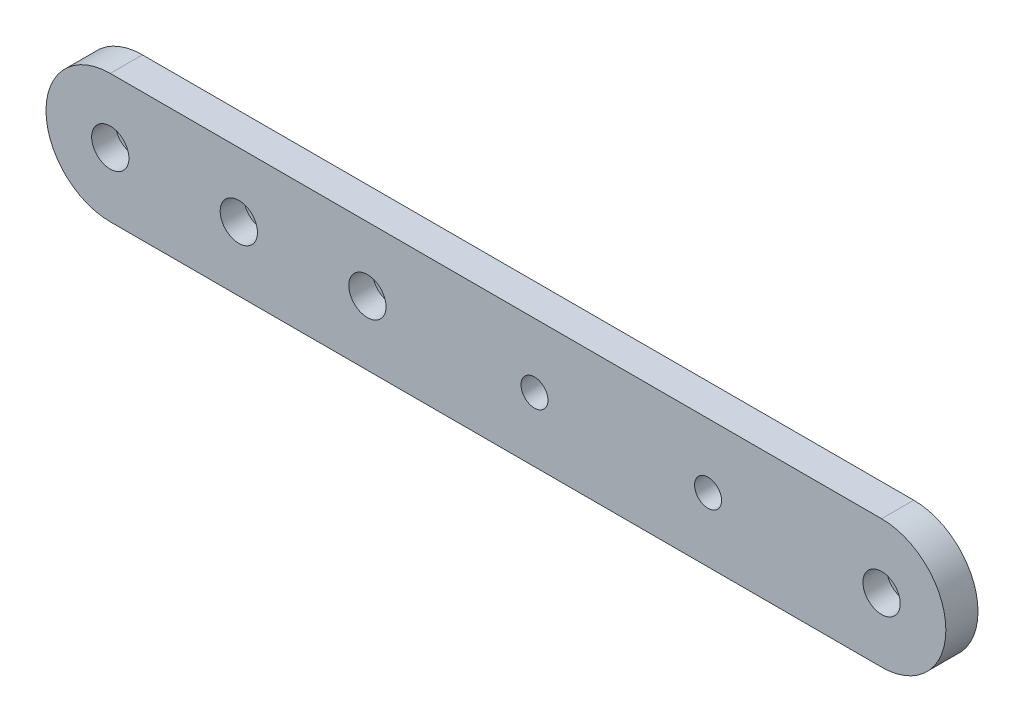
ISO-10303-21;
HEADER;
FILE_DESCRIPTION(('STEP AP214'),'2;1');
FILE_NAME('part.step','',(''),(''),'','','');
FILE_SCHEMA(('AUTOMOTIVE_DESIGN { 1 0 10303 214 1 1 1 1 }'));
ENDSEC;
DATA;
#1=APPLICATION_CONTEXT('core data for automotive mechanical design processes');
#2=APPLICATION_PROTOCOL_DEFINITION('international standard','automotive_design',2000,#1);
#3=PRODUCT_CONTEXT('',#1,'mechanical');
#4=PRODUCT('Part','Part','',(#3));
#5=PRODUCT_RELATED_PRODUCT_CATEGORY('part','',(#4));
#6=PRODUCT_DEFINITION_FORMATION('','',#4);
#7=PRODUCT_DEFINITION_CONTEXT('part definition',#1,'design');
#8=PRODUCT_DEFINITION('design','',#6,#7);
#9=PRODUCT_DEFINITION_SHAPE('','',#8);
#10=(LENGTH_UNIT() NAMED_UNIT(*) SI_UNIT(.MILLI.,.METRE.));
#11=(NAMED_UNIT(*) PLANE_ANGLE_UNIT() SI_UNIT($,.RADIAN.));
#12=(NAMED_UNIT(*) SI_UNIT($,.STERADIAN.) SOLID_ANGLE_UNIT());
#13=UNCERTAINTY_MEASURE_WITH_UNIT(LENGTH_MEASURE(1.E-05),#10,'distance_accuracy_value','');
#14=(GEOMETRIC_REPRESENTATION_CONTEXT(3) GLOBAL_UNCERTAINTY_ASSIGNED_CONTEXT((#13)) GLOBAL_UNIT_ASSIGNED_CONTEXT((#10,
#11,#12)) REPRESENTATION_CONTEXT('',''));
#15=CARTESIAN_POINT('',(0.,0.,0.));
#16=DIRECTION('',(0.,0.,1.));
#17=DIRECTION('',(1.,0.,0.));
#18=AXIS2_PLACEMENT_3D('',#15,#16,#17);
#19=CARTESIAN_POINT('',(-60.,0.,5.));
#20=DIRECTION('',(0.,0.,-1.));
#21=DIRECTION('',(-1.,0.,0.));
#22=AXIS2_PLACEMENT_3D('',#19,#20,#21);
#23=PLANE('',#22);
#24=CARTESIAN_POINT('',(33.,0.,5.0000000000001));
#25=DIRECTION('',(0.,0.,-1.));
#26=DIRECTION('',(-1.,0.,0.));
#27=AXIS2_PLACEMENT_3D('',#24,#25,#26);
#28=CIRCLE('',#27,2.1);
#29=CARTESIAN_POINT('',(30.9,0.,5.0000000000001));
#30=VERTEX_POINT('',#29);
#31=EDGE_CURVE('E246',#30,#30,#28,.T.);
#32=ORIENTED_EDGE('',*,*,#31,.T.);
#33=EDGE_LOOP('',(#32));
#34=FACE_BOUND('',#33,.T.);
#35=CARTESIAN_POINT('',(6.00000000000001,0.,5.0000000000001));
#36=DIRECTION('',(0.,0.,-1.));
#37=DIRECTION('',(-1.,0.,0.));
#38=AXIS2_PLACEMENT_3D('',#35,#36,#37);
#39=CIRCLE('',#38,2.1);
#40=CARTESIAN_POINT('',(3.90000000000001,0.,5.0000000000001));
#41=VERTEX_POINT('',#40);
#42=EDGE_CURVE('E254',#41,#41,#39,.T.);
#43=ORIENTED_EDGE('',*,*,#42,.T.);
#44=EDGE_LOOP('',(#43));
#45=FACE_BOUND('',#44,.T.);
#46=CARTESIAN_POINT('',(-40.,0.,5.00000000000008));
#47=DIRECTION('',(0.,0.,-1.));
#48=DIRECTION('',(-1.,0.,0.));
#49=AXIS2_PLACEMENT_3D('',#46,#47,#48);
#50=CIRCLE('',#49,2.9);
#51=CARTESIAN_POINT('',(-42.9,0.,5.00000000000008));
#52=VERTEX_POINT('',#51);
#53=EDGE_CURVE('E258',#52,#52,#50,.T.);
#54=ORIENTED_EDGE('',*,*,#53,.T.);
#55=EDGE_LOOP('',(#54));
#56=FACE_BOUND('',#55,.T.);
#57=CARTESIAN_POINT('',(-20.,0.,5.00000000000007));
#58=DIRECTION('',(0.,0.,-1.));
#59=DIRECTION('',(-1.,0.,0.));
#60=AXIS2_PLACEMENT_3D('',#57,#58,#59);
#61=CIRCLE('',#60,2.9);
#62=CARTESIAN_POINT('',(-22.9,0.,5.00000000000007));
#63=VERTEX_POINT('',#62);
#64=EDGE_CURVE('E117',#63,#63,#61,.T.);
#65=ORIENTED_EDGE('',*,*,#64,.T.);
#66=EDGE_LOOP('',(#65));
#67=FACE_BOUND('',#66,.T.);
#68=CARTESIAN_POINT('',(-60.,0.,5.0000000000001));
#69=DIRECTION('',(0.,0.,-1.));
#70=DIRECTION('',(-1.,0.,0.));
#71=AXIS2_PLACEMENT_3D('',#68,#69,#70);
#72=CIRCLE('',#71,2.89999999999999);
#73=CARTESIAN_POINT('',(-62.9,0.,5.0000000000001));
#74=VERTEX_POINT('',#73);
#75=EDGE_CURVE('E113',#74,#74,#72,.T.);
#76=ORIENTED_EDGE('',*,*,#75,.T.);
#77=EDGE_LOOP('',(#76));
#78=FACE_BOUND('',#77,.T.);
#79=CARTESIAN_POINT('',(60.,0.,5.00000000000001));
#80=DIRECTION('',(0.,0.,-1.));
#81=DIRECTION('',(-1.,0.,0.));
#82=AXIS2_PLACEMENT_3D('',#79,#80,#81);
#83=CIRCLE('',#82,2.89999999999989);
#84=CARTESIAN_POINT('',(57.1000000000001,0.,5.00000000000001));
#85=VERTEX_POINT('',#84);
#86=EDGE_CURVE('E109',#85,#85,#83,.T.);
#87=ORIENTED_EDGE('',*,*,#86,.T.);
#88=EDGE_LOOP('',(#87));
#89=FACE_BOUND('',#88,.T.);
#90=CARTESIAN_POINT('',(-60.,0.,5.));
#91=DIRECTION('',(0.,0.,1.));
#92=DIRECTION('',(-1.,0.,0.));
#93=AXIS2_PLACEMENT_3D('',#90,#91,#92);
#94=CIRCLE('',#93,10.);
#95=CARTESIAN_POINT('',(-60.,9.99999999999995,5.));
#96=VERTEX_POINT('',#95);
#97=CARTESIAN_POINT('',(-60.,-10.0000000000001,5.));
#98=VERTEX_POINT('',#97);
#99=EDGE_CURVE('E83',#96,#98,#94,.T.);
#100=ORIENTED_EDGE('',*,*,#99,.T.);
#101=DIRECTION('',(1.,0.,0.));
#102=VECTOR('',#101,1.);
#103=CARTESIAN_POINT('',(60.,-10.,5.));
#104=LINE('',#103,#102);
#105=CARTESIAN_POINT('',(60.,-10.,5.));
#106=VERTEX_POINT('',#105);
#107=EDGE_CURVE('E79',#98,#106,#104,.T.);
#108=ORIENTED_EDGE('',*,*,#107,.T.);
#109=CARTESIAN_POINT('',(60.,0.,5.));
#110=DIRECTION('',(0.,0.,1.));
#111=DIRECTION('',(1.,0.,0.));
#112=AXIS2_PLACEMENT_3D('',#109,#110,#111);
#113=CIRCLE('',#112,10.);
#114=CARTESIAN_POINT('',(60.,10.,5.));
#115=VERTEX_POINT('',#114);
#116=EDGE_CURVE('E81',#106,#115,#113,.T.);
#117=ORIENTED_EDGE('',*,*,#116,.T.);
#118=DIRECTION('',(-1.,0.,0.));
#119=VECTOR('',#118,1.);
#120=CARTESIAN_POINT('',(-60.,9.99999999999995,5.));
#121=LINE('',#120,#119);
#122=EDGE_CURVE('E49',#115,#96,#121,.T.);
#123=ORIENTED_EDGE('',*,*,#122,.T.);
#124=EDGE_LOOP('',(#100,#108,#117,#123));
#125=FACE_BOUND('',#124,.T.);
#126=ADVANCED_FACE('F30',(#34,#45,#56,#67,#78,#89,#125),#23,.F.);
#127=CARTESIAN_POINT('',(-60.,0.,0.));
#128=DIRECTION('',(0.,0.,-1.));
#129=DIRECTION('',(-1.,0.,0.));
#130=AXIS2_PLACEMENT_3D('',#127,#128,#129);
#131=PLANE('',#130);
#132=CARTESIAN_POINT('',(33.,0.,0.));
#133=DIRECTION('',(0.,0.,-1.));
#134=DIRECTION('',(-1.,0.,0.));
#135=AXIS2_PLACEMENT_3D('',#132,#133,#134);
#136=CIRCLE('',#135,2.1);
#137=CARTESIAN_POINT('',(30.9,0.,0.));
#138=VERTEX_POINT('',#137);
#139=EDGE_CURVE('E249',#138,#138,#136,.T.);
#140=ORIENTED_EDGE('',*,*,#139,.F.);
#141=EDGE_LOOP('',(#140));
#142=FACE_BOUND('',#141,.T.);
#143=CARTESIAN_POINT('',(6.00000000000001,0.,0.));
#144=DIRECTION('',(0.,0.,-1.));
#145=DIRECTION('',(-1.,0.,0.));
#146=AXIS2_PLACEMENT_3D('',#143,#144,#145);
#147=CIRCLE('',#146,2.1);
#148=CARTESIAN_POINT('',(3.90000000000001,0.,0.));
#149=VERTEX_POINT('',#148);
#150=EDGE_CURVE('E251',#149,#149,#147,.T.);
#151=ORIENTED_EDGE('',*,*,#150,.F.);
#152=EDGE_LOOP('',(#151));
#153=FACE_BOUND('',#152,.T.);
#154=CARTESIAN_POINT('',(60.,0.,0.));
#155=DIRECTION('',(0.,0.,1.));
#156=DIRECTION('',(1.,0.,0.));
#157=AXIS2_PLACEMENT_3D('',#154,#155,#156);
#158=CIRCLE('',#157,1.5);
#159=CARTESIAN_POINT('',(61.5,0.,0.));
#160=VERTEX_POINT('',#159);
#161=EDGE_CURVE('E141',#160,#160,#158,.T.);
#162=ORIENTED_EDGE('',*,*,#161,.T.);
#163=EDGE_LOOP('',(#162));
#164=FACE_BOUND('',#163,.T.);
#165=CARTESIAN_POINT('',(-40.,0.,0.));
#166=DIRECTION('',(0.,0.,1.));
#167=DIRECTION('',(1.,0.,0.));
#168=AXIS2_PLACEMENT_3D('',#165,#166,#167);
#169=CIRCLE('',#168,1.5);
#170=CARTESIAN_POINT('',(-38.5,0.,0.));
#171=VERTEX_POINT('',#170);
#172=EDGE_CURVE('E99',#171,#171,#169,.T.);
#173=ORIENTED_EDGE('',*,*,#172,.T.);
#174=EDGE_LOOP('',(#173));
#175=FACE_BOUND('',#174,.T.);
#176=CARTESIAN_POINT('',(-60.,0.,0.));
#177=DIRECTION('',(0.,0.,1.));
#178=DIRECTION('',(-1.,0.,0.));
#179=AXIS2_PLACEMENT_3D('',#176,#177,#178);
#180=CIRCLE('',#179,10.);
#181=CARTESIAN_POINT('',(-60.,9.99999999999995,0.));
#182=VERTEX_POINT('',#181);
#183=CARTESIAN_POINT('',(-60.,-10.0000000000001,0.));
#184=VERTEX_POINT('',#183);
#185=EDGE_CURVE('E96',#182,#184,#180,.T.);
#186=ORIENTED_EDGE('',*,*,#185,.F.);
#187=DIRECTION('',(-1.,0.,0.));
#188=VECTOR('',#187,1.);
#189=CARTESIAN_POINT('',(-60.,9.99999999999995,0.));
#190=LINE('',#189,#188);
#191=CARTESIAN_POINT('',(60.,10.,0.));
#192=VERTEX_POINT('',#191);
#193=EDGE_CURVE('E72',#192,#182,#190,.T.);
#194=ORIENTED_EDGE('',*,*,#193,.F.);
#195=CARTESIAN_POINT('',(60.,0.,0.));
#196=DIRECTION('',(0.,0.,1.));
#197=DIRECTION('',(1.,0.,0.));
#198=AXIS2_PLACEMENT_3D('',#195,#196,#197);
#199=CIRCLE('',#198,10.);
#200=CARTESIAN_POINT('',(60.,-10.,0.));
#201=VERTEX_POINT('',#200);
#202=EDGE_CURVE('E66',#201,#192,#199,.T.);
#203=ORIENTED_EDGE('',*,*,#202,.F.);
#204=DIRECTION('',(1.,0.,0.));
#205=VECTOR('',#204,1.);
#206=CARTESIAN_POINT('',(60.,-10.,0.));
#207=LINE('',#206,#205);
#208=EDGE_CURVE('E87',#184,#201,#207,.T.);
#209=ORIENTED_EDGE('',*,*,#208,.F.);
#210=EDGE_LOOP('',(#186,#194,#203,#209));
#211=FACE_BOUND('',#210,.T.);
#212=CARTESIAN_POINT('',(-20.,0.,0.));
#213=DIRECTION('',(0.,0.,1.));
#214=DIRECTION('',(1.,0.,0.));
#215=AXIS2_PLACEMENT_3D('',#212,#213,#214);
#216=CIRCLE('',#215,1.5);
#217=CARTESIAN_POINT('',(-18.5,0.,0.));
#218=VERTEX_POINT('',#217);
#219=EDGE_CURVE('E144',#218,#218,#216,.T.);
#220=ORIENTED_EDGE('',*,*,#219,.T.);
#221=EDGE_LOOP('',(#220));
#222=FACE_BOUND('',#221,.T.);
#223=CARTESIAN_POINT('',(-60.,0.,0.));
#224=DIRECTION('',(0.,0.,1.));
#225=DIRECTION('',(1.,0.,0.));
#226=AXIS2_PLACEMENT_3D('',#223,#224,#225);
#227=CIRCLE('',#226,1.50000000000002);
#228=CARTESIAN_POINT('',(-58.5,0.,0.));
#229=VERTEX_POINT('',#228);
#230=EDGE_CURVE('E108',#229,#229,#227,.T.);
#231=ORIENTED_EDGE('',*,*,#230,.T.);
#232=EDGE_LOOP('',(#231));
#233=FACE_BOUND('',#232,.T.);
#234=ADVANCED_FACE('F150',(#142,#153,#164,#175,#211,#222,#233),#131,.T.);
#235=CARTESIAN_POINT('',(-60.,0.,5.));
#236=DIRECTION('',(0.,0.,-1.));
#237=DIRECTION('',(-1.,0.,0.));
#238=AXIS2_PLACEMENT_3D('',#235,#236,#237);
#239=CYLINDRICAL_SURFACE('',#238,10.);
#240=ORIENTED_EDGE('',*,*,#185,.T.);
#241=DIRECTION('',(0.,0.,-1.));
#242=VECTOR('',#241,1.);
#243=CARTESIAN_POINT('',(-60.,-10.0000000000001,5.));
#244=LINE('',#243,#242);
#245=EDGE_CURVE('E11',#98,#184,#244,.T.);
#246=ORIENTED_EDGE('',*,*,#245,.F.);
#247=ORIENTED_EDGE('',*,*,#99,.F.);
#248=DIRECTION('',(0.,0.,-1.));
#249=VECTOR('',#248,1.);
#250=CARTESIAN_POINT('',(-60.,9.99999999999995,5.));
#251=LINE('',#250,#249);
#252=EDGE_CURVE('E92',#96,#182,#251,.T.);
#253=ORIENTED_EDGE('',*,*,#252,.T.);
#254=EDGE_LOOP('',(#240,#246,#247,#253));
#255=FACE_BOUND('',#254,.T.);
#256=ADVANCED_FACE('F32',(#255),#239,.T.);
#257=CARTESIAN_POINT('',(60.,-10.,5.));
#258=DIRECTION('',(0.,1.,0.));
#259=DIRECTION('',(-1.,0.,0.));
#260=AXIS2_PLACEMENT_3D('',#257,#258,#259);
#261=PLANE('',#260);
#262=ORIENTED_EDGE('',*,*,#208,.T.);
#263=DIRECTION('',(0.,0.,-1.));
#264=VECTOR('',#263,1.);
#265=CARTESIAN_POINT('',(60.,-10.,5.));
#266=LINE('',#265,#264);
#267=EDGE_CURVE('E40',#106,#201,#266,.T.);
#268=ORIENTED_EDGE('',*,*,#267,.F.);
#269=ORIENTED_EDGE('',*,*,#107,.F.);
#270=ORIENTED_EDGE('',*,*,#245,.T.);
#271=EDGE_LOOP('',(#262,#268,#269,#270));
#272=FACE_BOUND('',#271,.T.);
#273=ADVANCED_FACE('F86',(#272),#261,.F.);
#274=CARTESIAN_POINT('',(60.,0.,5.));
#275=DIRECTION('',(0.,0.,-1.));
#276=DIRECTION('',(-1.,0.,0.));
#277=AXIS2_PLACEMENT_3D('',#274,#275,#276);
#278=CYLINDRICAL_SURFACE('',#277,10.);
#279=ORIENTED_EDGE('',*,*,#202,.T.);
#280=DIRECTION('',(0.,0.,-1.));
#281=VECTOR('',#280,1.);
#282=CARTESIAN_POINT('',(60.,10.,5.));
#283=LINE('',#282,#281);
#284=EDGE_CURVE('E88',#115,#192,#283,.T.);
#285=ORIENTED_EDGE('',*,*,#284,.F.);
#286=ORIENTED_EDGE('',*,*,#116,.F.);
#287=ORIENTED_EDGE('',*,*,#267,.T.);
#288=EDGE_LOOP('',(#279,#285,#286,#287));
#289=FACE_BOUND('',#288,.T.);
#290=ADVANCED_FACE('F90',(#289),#278,.T.);
#291=CARTESIAN_POINT('',(-60.,9.99999999999995,5.));
#292=DIRECTION('',(0.,-1.,0.));
#293=DIRECTION('',(1.,0.,0.));
#294=AXIS2_PLACEMENT_3D('',#291,#292,#293);
#295=PLANE('',#294);
#296=ORIENTED_EDGE('',*,*,#193,.T.);
#297=ORIENTED_EDGE('',*,*,#252,.F.);
#298=ORIENTED_EDGE('',*,*,#122,.F.);
#299=ORIENTED_EDGE('',*,*,#284,.T.);
#300=EDGE_LOOP('',(#296,#297,#298,#299));
#301=FACE_BOUND('',#300,.T.);
#302=ADVANCED_FACE('F156',(#301),#295,.F.);
#303=CARTESIAN_POINT('',(-40.,0.,5.));
#304=DIRECTION('',(0.,0.,-1.));
#305=DIRECTION('',(-1.,0.,0.));
#306=AXIS2_PLACEMENT_3D('',#303,#304,#305);
#307=CYLINDRICAL_SURFACE('',#306,1.5);
#308=CARTESIAN_POINT('',(-40.,0.,1.30000000000014));
#309=DIRECTION('',(0.,0.,-1.));
#310=DIRECTION('',(-1.,0.,0.));
#311=AXIS2_PLACEMENT_3D('',#308,#309,#310);
#312=CIRCLE('',#311,1.5);
#313=CARTESIAN_POINT('',(-41.5,0.,1.30000000000014));
#314=VERTEX_POINT('',#313);
#315=EDGE_CURVE('E34',#314,#314,#312,.T.);
#316=ORIENTED_EDGE('',*,*,#315,.F.);
#317=EDGE_LOOP('',(#316));
#318=FACE_BOUND('',#317,.T.);
#319=ORIENTED_EDGE('',*,*,#172,.F.);
#320=EDGE_LOOP('',(#319));
#321=FACE_BOUND('',#320,.T.);
#322=ADVANCED_FACE('F153',(#318,#321),#307,.F.);
#323=CARTESIAN_POINT('',(-20.,0.,5.));
#324=DIRECTION('',(0.,0.,-1.));
#325=DIRECTION('',(-1.,0.,0.));
#326=AXIS2_PLACEMENT_3D('',#323,#324,#325);
#327=CYLINDRICAL_SURFACE('',#326,1.5);
#328=CARTESIAN_POINT('',(-20.,0.,1.30000000000012));
#329=DIRECTION('',(0.,0.,-1.));
#330=DIRECTION('',(-1.,0.,0.));
#331=AXIS2_PLACEMENT_3D('',#328,#329,#330);
#332=CIRCLE('',#331,1.5);
#333=CARTESIAN_POINT('',(-21.5,0.,1.30000000000012));
#334=VERTEX_POINT('',#333);
#335=EDGE_CURVE('E114',#334,#334,#332,.T.);
#336=ORIENTED_EDGE('',*,*,#335,.F.);
#337=EDGE_LOOP('',(#336));
#338=FACE_BOUND('',#337,.T.);
#339=ORIENTED_EDGE('',*,*,#219,.F.);
#340=EDGE_LOOP('',(#339));
#341=FACE_BOUND('',#340,.T.);
#342=ADVANCED_FACE('F155',(#338,#341),#327,.F.);
#343=CARTESIAN_POINT('',(60.,0.,5.));
#344=DIRECTION('',(0.,0.,-1.));
#345=DIRECTION('',(-1.,0.,0.));
#346=AXIS2_PLACEMENT_3D('',#343,#344,#345);
#347=CYLINDRICAL_SURFACE('',#346,1.5);
#348=CARTESIAN_POINT('',(60.,0.,1.30000000000007));
#349=DIRECTION('',(0.,0.,-1.));
#350=DIRECTION('',(-1.,0.,0.));
#351=AXIS2_PLACEMENT_3D('',#348,#349,#350);
#352=CIRCLE('',#351,1.5);
#353=CARTESIAN_POINT('',(58.5,0.,1.30000000000007));
#354=VERTEX_POINT('',#353);
#355=EDGE_CURVE('E105',#354,#354,#352,.T.);
#356=ORIENTED_EDGE('',*,*,#355,.F.);
#357=EDGE_LOOP('',(#356));
#358=FACE_BOUND('',#357,.T.);
#359=ORIENTED_EDGE('',*,*,#161,.F.);
#360=EDGE_LOOP('',(#359));
#361=FACE_BOUND('',#360,.T.);
#362=ADVANCED_FACE('F163',(#358,#361),#347,.F.);
#363=CARTESIAN_POINT('',(-60.,0.,5.));
#364=DIRECTION('',(0.,0.,-1.));
#365=DIRECTION('',(-1.,0.,0.));
#366=AXIS2_PLACEMENT_3D('',#363,#364,#365);
#367=CYLINDRICAL_SURFACE('',#366,1.50000000000002);
#368=CARTESIAN_POINT('',(-60.,0.,1.30000000000015));
#369=DIRECTION('',(0.,0.,-1.));
#370=DIRECTION('',(-1.,0.,0.));
#371=AXIS2_PLACEMENT_3D('',#368,#369,#370);
#372=CIRCLE('',#371,1.50000000000002);
#373=CARTESIAN_POINT('',(-61.5,0.,1.30000000000015));
#374=VERTEX_POINT('',#373);
#375=EDGE_CURVE('E110',#374,#374,#372,.T.);
#376=ORIENTED_EDGE('',*,*,#375,.F.);
#377=EDGE_LOOP('',(#376));
#378=FACE_BOUND('',#377,.T.);
#379=ORIENTED_EDGE('',*,*,#230,.F.);
#380=EDGE_LOOP('',(#379));
#381=FACE_BOUND('',#380,.T.);
#382=ADVANCED_FACE('F193',(#378,#381),#367,.F.);
#383=CARTESIAN_POINT('',(60.,0.,5.00000000000001));
#384=DIRECTION('',(0.,0.,-1.));
#385=DIRECTION('',(-1.,0.,0.));
#386=AXIS2_PLACEMENT_3D('',#383,#384,#385);
#387=CYLINDRICAL_SURFACE('',#386,2.89999999999989);
#388=ORIENTED_EDGE('',*,*,#86,.F.);
#389=EDGE_LOOP('',(#388));
#390=FACE_BOUND('',#389,.T.);
#391=CARTESIAN_POINT('',(60.,0.,1.30000000000007));
#392=DIRECTION('',(0.,0.,-1.));
#393=DIRECTION('',(-1.,0.,0.));
#394=AXIS2_PLACEMENT_3D('',#391,#392,#393);
#395=CIRCLE('',#394,2.89999999999989);
#396=CARTESIAN_POINT('',(57.1000000000001,0.,1.30000000000007));
#397=VERTEX_POINT('',#396);
#398=EDGE_CURVE('E112',#397,#397,#395,.T.);
#399=ORIENTED_EDGE('',*,*,#398,.T.);
#400=EDGE_LOOP('',(#399));
#401=FACE_BOUND('',#400,.T.);
#402=ADVANCED_FACE('F195',(#390,#401),#387,.F.);
#403=CARTESIAN_POINT('',(60.,0.,1.30000000000007));
#404=DIRECTION('',(0.,0.,-1.));
#405=DIRECTION('',(-1.,0.,0.));
#406=AXIS2_PLACEMENT_3D('',#403,#404,#405);
#407=PLANE('',#406);
#408=ORIENTED_EDGE('',*,*,#355,.T.);
#409=EDGE_LOOP('',(#408));
#410=FACE_BOUND('',#409,.T.);
#411=ORIENTED_EDGE('',*,*,#398,.F.);
#412=EDGE_LOOP('',(#411));
#413=FACE_BOUND('',#412,.T.);
#414=ADVANCED_FACE('F202',(#410,#413),#407,.F.);
#415=CARTESIAN_POINT('',(-60.,0.,5.0000000000001));
#416=DIRECTION('',(0.,0.,-1.));
#417=DIRECTION('',(-1.,0.,0.));
#418=AXIS2_PLACEMENT_3D('',#415,#416,#417);
#419=CYLINDRICAL_SURFACE('',#418,2.89999999999999);
#420=ORIENTED_EDGE('',*,*,#75,.F.);
#421=EDGE_LOOP('',(#420));
#422=FACE_BOUND('',#421,.T.);
#423=CARTESIAN_POINT('',(-60.,0.,1.30000000000015));
#424=DIRECTION('',(0.,0.,-1.));
#425=DIRECTION('',(-1.,0.,0.));
#426=AXIS2_PLACEMENT_3D('',#423,#424,#425);
#427=CIRCLE('',#426,2.89999999999999);
#428=CARTESIAN_POINT('',(-62.9,0.,1.30000000000015));
#429=VERTEX_POINT('',#428);
#430=EDGE_CURVE('E116',#429,#429,#427,.T.);
#431=ORIENTED_EDGE('',*,*,#430,.T.);
#432=EDGE_LOOP('',(#431));
#433=FACE_BOUND('',#432,.T.);
#434=ADVANCED_FACE('F211',(#422,#433),#419,.F.);
#435=CARTESIAN_POINT('',(-60.,0.,1.30000000000015));
#436=DIRECTION('',(0.,0.,-1.));
#437=DIRECTION('',(-1.,0.,0.));
#438=AXIS2_PLACEMENT_3D('',#435,#436,#437);
#439=PLANE('',#438);
#440=ORIENTED_EDGE('',*,*,#375,.T.);
#441=EDGE_LOOP('',(#440));
#442=FACE_BOUND('',#441,.T.);
#443=ORIENTED_EDGE('',*,*,#430,.F.);
#444=EDGE_LOOP('',(#443));
#445=FACE_BOUND('',#444,.T.);
#446=ADVANCED_FACE('F215',(#442,#445),#439,.F.);
#447=CARTESIAN_POINT('',(-20.,0.,5.00000000000007));
#448=DIRECTION('',(0.,0.,-1.));
#449=DIRECTION('',(-1.,0.,0.));
#450=AXIS2_PLACEMENT_3D('',#447,#448,#449);
#451=CYLINDRICAL_SURFACE('',#450,2.9);
#452=ORIENTED_EDGE('',*,*,#64,.F.);
#453=EDGE_LOOP('',(#452));
#454=FACE_BOUND('',#453,.T.);
#455=CARTESIAN_POINT('',(-20.,0.,1.30000000000012));
#456=DIRECTION('',(0.,0.,-1.));
#457=DIRECTION('',(-1.,0.,0.));
#458=AXIS2_PLACEMENT_3D('',#455,#456,#457);
#459=CIRCLE('',#458,2.9);
#460=CARTESIAN_POINT('',(-22.9,0.,1.30000000000012));
#461=VERTEX_POINT('',#460);
#462=EDGE_CURVE('E123',#461,#461,#459,.T.);
#463=ORIENTED_EDGE('',*,*,#462,.T.);
#464=EDGE_LOOP('',(#463));
#465=FACE_BOUND('',#464,.T.);
#466=ADVANCED_FACE('F219',(#454,#465),#451,.F.);
#467=CARTESIAN_POINT('',(-20.,0.,1.30000000000012));
#468=DIRECTION('',(0.,0.,-1.));
#469=DIRECTION('',(-1.,0.,0.));
#470=AXIS2_PLACEMENT_3D('',#467,#468,#469);
#471=PLANE('',#470);
#472=ORIENTED_EDGE('',*,*,#335,.T.);
#473=EDGE_LOOP('',(#472));
#474=FACE_BOUND('',#473,.T.);
#475=ORIENTED_EDGE('',*,*,#462,.F.);
#476=EDGE_LOOP('',(#475));
#477=FACE_BOUND('',#476,.T.);
#478=ADVANCED_FACE('F223',(#474,#477),#471,.F.);
#479=CARTESIAN_POINT('',(-40.,0.,5.00000000000008));
#480=DIRECTION('',(0.,0.,-1.));
#481=DIRECTION('',(-1.,0.,0.));
#482=AXIS2_PLACEMENT_3D('',#479,#480,#481);
#483=CYLINDRICAL_SURFACE('',#482,2.9);
#484=ORIENTED_EDGE('',*,*,#53,.F.);
#485=EDGE_LOOP('',(#484));
#486=FACE_BOUND('',#485,.T.);
#487=CARTESIAN_POINT('',(-40.,0.,1.30000000000014));
#488=DIRECTION('',(0.,0.,-1.));
#489=DIRECTION('',(-1.,0.,0.));
#490=AXIS2_PLACEMENT_3D('',#487,#488,#489);
#491=CIRCLE('',#490,2.9);
#492=CARTESIAN_POINT('',(-42.9,0.,1.30000000000014));
#493=VERTEX_POINT('',#492);
#494=EDGE_CURVE('E130',#493,#493,#491,.T.);
#495=ORIENTED_EDGE('',*,*,#494,.T.);
#496=EDGE_LOOP('',(#495));
#497=FACE_BOUND('',#496,.T.);
#498=ADVANCED_FACE('F227',(#486,#497),#483,.F.);
#499=CARTESIAN_POINT('',(-40.,0.,1.30000000000014));
#500=DIRECTION('',(0.,0.,-1.));
#501=DIRECTION('',(-1.,0.,0.));
#502=AXIS2_PLACEMENT_3D('',#499,#500,#501);
#503=PLANE('',#502);
#504=ORIENTED_EDGE('',*,*,#315,.T.);
#505=EDGE_LOOP('',(#504));
#506=FACE_BOUND('',#505,.T.);
#507=ORIENTED_EDGE('',*,*,#494,.F.);
#508=EDGE_LOOP('',(#507));
#509=FACE_BOUND('',#508,.T.);
#510=ADVANCED_FACE('F230',(#506,#509),#503,.F.);
#511=CARTESIAN_POINT('',(6.00000000000001,0.,5.0000000000001));
#512=DIRECTION('',(0.,0.,-1.));
#513=DIRECTION('',(-1.,0.,0.));
#514=AXIS2_PLACEMENT_3D('',#511,#512,#513);
#515=CYLINDRICAL_SURFACE('',#514,2.1);
#516=ORIENTED_EDGE('',*,*,#42,.F.);
#517=EDGE_LOOP('',(#516));
#518=FACE_BOUND('',#517,.T.);
#519=ORIENTED_EDGE('',*,*,#150,.T.);
#520=EDGE_LOOP('',(#519));
#521=FACE_BOUND('',#520,.T.);
#522=ADVANCED_FACE('F234',(#518,#521),#515,.F.);
#523=CARTESIAN_POINT('',(33.,0.,5.0000000000001));
#524=DIRECTION('',(0.,0.,-1.));
#525=DIRECTION('',(-1.,0.,0.));
#526=AXIS2_PLACEMENT_3D('',#523,#524,#525);
#527=CYLINDRICAL_SURFACE('',#526,2.1);
#528=ORIENTED_EDGE('',*,*,#31,.F.);
#529=EDGE_LOOP('',(#528));
#530=FACE_BOUND('',#529,.T.);
#531=ORIENTED_EDGE('',*,*,#139,.T.);
#532=EDGE_LOOP('',(#531));
#533=FACE_BOUND('',#532,.T.);
#534=ADVANCED_FACE('F238',(#530,#533),#527,.F.);
#535=CLOSED_SHELL('',(#126,#234,#256,#273,#290,#302,#322,#342,#362,#382,#402,#414,#434,#446,
#466,#478,#498,#510,#522,#534));
#536=MANIFOLD_SOLID_BREP('B2',#535);
#537=ADVANCED_BREP_SHAPE_REPRESENTATION('',(#18,#536),#14);
#538=SHAPE_DEFINITION_REPRESENTATION(#9,#537);
ENDSEC;
END-ISO-10303-21;
